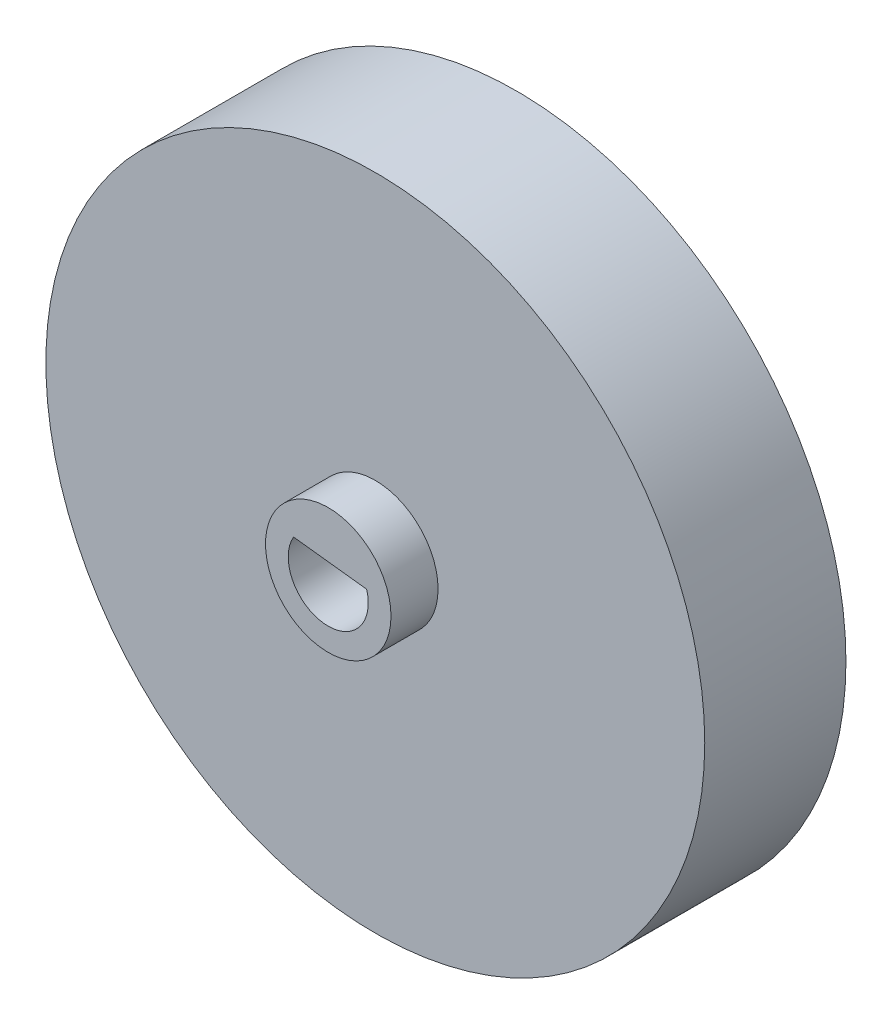
ISO-10303-21;
HEADER;
FILE_DESCRIPTION(('STEP AP214'),'2;1');
FILE_NAME('part.step','',(''),(''),'','','');
FILE_SCHEMA(('AUTOMOTIVE_DESIGN { 1 0 10303 214 1 1 1 1 }'));
ENDSEC;
DATA;
#1=APPLICATION_CONTEXT('core data for automotive mechanical design processes');
#2=APPLICATION_PROTOCOL_DEFINITION('international standard','automotive_design',2000,#1);
#3=PRODUCT_CONTEXT('',#1,'mechanical');
#4=PRODUCT('Part','Part','',(#3));
#5=PRODUCT_RELATED_PRODUCT_CATEGORY('part','',(#4));
#6=PRODUCT_DEFINITION_FORMATION('','',#4);
#7=PRODUCT_DEFINITION_CONTEXT('part definition',#1,'design');
#8=PRODUCT_DEFINITION('design','',#6,#7);
#9=PRODUCT_DEFINITION_SHAPE('','',#8);
#10=(LENGTH_UNIT() NAMED_UNIT(*) SI_UNIT(.MILLI.,.METRE.));
#11=(NAMED_UNIT(*) PLANE_ANGLE_UNIT() SI_UNIT($,.RADIAN.));
#12=(NAMED_UNIT(*) SI_UNIT($,.STERADIAN.) SOLID_ANGLE_UNIT());
#13=UNCERTAINTY_MEASURE_WITH_UNIT(LENGTH_MEASURE(1.E-05),#10,'distance_accuracy_value','');
#14=(GEOMETRIC_REPRESENTATION_CONTEXT(3) GLOBAL_UNCERTAINTY_ASSIGNED_CONTEXT((#13)) GLOBAL_UNIT_ASSIGNED_CONTEXT((#10,
#11,#12)) REPRESENTATION_CONTEXT('',''));
#15=CARTESIAN_POINT('',(0.,0.,0.));
#16=DIRECTION('',(0.,0.,1.));
#17=DIRECTION('',(1.,0.,0.));
#18=AXIS2_PLACEMENT_3D('',#15,#16,#17);
#19=CARTESIAN_POINT('',(0.,0.,24.));
#20=DIRECTION('',(0.,0.,1.));
#21=DIRECTION('',(1.,0.,0.));
#22=AXIS2_PLACEMENT_3D('',#19,#20,#21);
#23=PLANE('',#22);
#24=CARTESIAN_POINT('',(0.,0.,24.));
#25=DIRECTION('',(0.,0.,1.));
#26=DIRECTION('',(1.,0.,0.));
#27=AXIS2_PLACEMENT_3D('',#24,#25,#26);
#28=CIRCLE('',#27,8.);
#29=CARTESIAN_POINT('',(8.,0.,24.));
#30=VERTEX_POINT('',#29);
#31=EDGE_CURVE('E11',#30,#30,#28,.T.);
#32=ORIENTED_EDGE('',*,*,#31,.T.);
#33=EDGE_LOOP('',(#32));
#34=FACE_BOUND('',#33,.T.);
#35=DIRECTION('',(-0.993068456954926,0.117537397457838,0.));
#36=VECTOR('',#35,1.);
#37=CARTESIAN_POINT('',(4.89403723026289,1.43471237145316,24.));
#38=LINE('',#37,#36);
#39=CARTESIAN_POINT('',(4.89403723026289,1.43471237145316,24.));
#40=VERTEX_POINT('',#39);
#41=CARTESIAN_POINT('',(-4.42388764043154,2.53756145636654,24.));
#42=VERTEX_POINT('',#41);
#43=EDGE_CURVE('E84',#40,#42,#38,.T.);
#44=ORIENTED_EDGE('',*,*,#43,.F.);
#45=CARTESIAN_POINT('',(0.,0.,24.));
#46=DIRECTION('',(0.,0.,1.));
#47=DIRECTION('',(1.,0.,0.));
#48=AXIS2_PLACEMENT_3D('',#45,#46,#47);
#49=CIRCLE('',#48,5.1);
#50=EDGE_CURVE('E72',#42,#40,#49,.T.);
#51=ORIENTED_EDGE('',*,*,#50,.F.);
#52=EDGE_LOOP('',(#44,#51));
#53=FACE_BOUND('',#52,.T.);
#54=ADVANCED_FACE('F41',(#34,#53),#23,.T.);
#55=CARTESIAN_POINT('',(0.,0.,0.));
#56=DIRECTION('',(0.,0.,1.));
#57=DIRECTION('',(1.,0.,0.));
#58=AXIS2_PLACEMENT_3D('',#55,#56,#57);
#59=PLANE('',#58);
#60=CARTESIAN_POINT('',(0.,0.,0.));
#61=DIRECTION('',(0.,0.,1.));
#62=DIRECTION('',(1.,0.,0.));
#63=AXIS2_PLACEMENT_3D('',#60,#61,#62);
#64=CIRCLE('',#63,42.);
#65=CARTESIAN_POINT('',(42.,0.,0.));
#66=VERTEX_POINT('',#65);
#67=EDGE_CURVE('E81',#66,#66,#64,.T.);
#68=ORIENTED_EDGE('',*,*,#67,.F.);
#69=EDGE_LOOP('',(#68));
#70=FACE_BOUND('',#69,.T.);
#71=CARTESIAN_POINT('',(0.,0.,0.));
#72=DIRECTION('',(0.,0.,1.));
#73=DIRECTION('',(1.,0.,0.));
#74=AXIS2_PLACEMENT_3D('',#71,#72,#73);
#75=CIRCLE('',#74,5.1);
#76=CARTESIAN_POINT('',(-4.42388764043154,2.53756145636654,0.));
#77=VERTEX_POINT('',#76);
#78=CARTESIAN_POINT('',(4.89403723026289,1.43471237145316,0.));
#79=VERTEX_POINT('',#78);
#80=EDGE_CURVE('E62',#77,#79,#75,.T.);
#81=ORIENTED_EDGE('',*,*,#80,.T.);
#82=DIRECTION('',(-0.993068456954926,0.117537397457838,0.));
#83=VECTOR('',#82,1.);
#84=CARTESIAN_POINT('',(4.89403723026289,1.43471237145316,0.));
#85=LINE('',#84,#83);
#86=EDGE_CURVE('E68',#79,#77,#85,.T.);
#87=ORIENTED_EDGE('',*,*,#86,.T.);
#88=EDGE_LOOP('',(#81,#87));
#89=FACE_BOUND('',#88,.T.);
#90=ADVANCED_FACE('F77',(#70,#89),#59,.F.);
#91=CARTESIAN_POINT('',(0.,0.,24.));
#92=DIRECTION('',(0.,0.,-1.));
#93=DIRECTION('',(-1.,0.,0.));
#94=AXIS2_PLACEMENT_3D('',#91,#92,#93);
#95=CYLINDRICAL_SURFACE('',#94,8.);
#96=CARTESIAN_POINT('',(0.,0.,18.));
#97=DIRECTION('',(0.,0.,1.));
#98=DIRECTION('',(1.,0.,0.));
#99=AXIS2_PLACEMENT_3D('',#96,#97,#98);
#100=CIRCLE('',#99,8.);
#101=CARTESIAN_POINT('',(8.,0.,18.));
#102=VERTEX_POINT('',#101);
#103=EDGE_CURVE('E89',#102,#102,#100,.T.);
#104=ORIENTED_EDGE('',*,*,#103,.T.);
#105=EDGE_LOOP('',(#104));
#106=FACE_BOUND('',#105,.T.);
#107=ORIENTED_EDGE('',*,*,#31,.F.);
#108=EDGE_LOOP('',(#107));
#109=FACE_BOUND('',#108,.T.);
#110=ADVANCED_FACE('F43',(#106,#109),#95,.T.);
#111=CARTESIAN_POINT('',(0.,0.,24.));
#112=DIRECTION('',(0.,0.,-1.));
#113=DIRECTION('',(-1.,0.,0.));
#114=AXIS2_PLACEMENT_3D('',#111,#112,#113);
#115=CYLINDRICAL_SURFACE('',#114,5.1);
#116=ORIENTED_EDGE('',*,*,#80,.F.);
#117=DIRECTION('',(0.,0.,-1.));
#118=VECTOR('',#117,1.);
#119=CARTESIAN_POINT('',(-4.42388764043154,2.53756145636654,24.));
#120=LINE('',#119,#118);
#121=EDGE_CURVE('E70',#42,#77,#120,.T.);
#122=ORIENTED_EDGE('',*,*,#121,.F.);
#123=ORIENTED_EDGE('',*,*,#50,.T.);
#124=DIRECTION('',(0.,0.,-1.));
#125=VECTOR('',#124,1.);
#126=CARTESIAN_POINT('',(4.89403723026289,1.43471237145316,24.));
#127=LINE('',#126,#125);
#128=EDGE_CURVE('E49',#40,#79,#127,.T.);
#129=ORIENTED_EDGE('',*,*,#128,.T.);
#130=EDGE_LOOP('',(#116,#122,#123,#129));
#131=FACE_BOUND('',#130,.T.);
#132=ADVANCED_FACE('F74',(#131),#115,.F.);
#133=CARTESIAN_POINT('',(4.89403723026289,1.43471237145316,24.));
#134=DIRECTION('',(-0.117537397457838,-0.993068456954926,0.));
#135=DIRECTION('',(0.993068456954926,-0.117537397457838,0.));
#136=AXIS2_PLACEMENT_3D('',#133,#134,#135);
#137=PLANE('',#136);
#138=ORIENTED_EDGE('',*,*,#86,.F.);
#139=ORIENTED_EDGE('',*,*,#128,.F.);
#140=ORIENTED_EDGE('',*,*,#43,.T.);
#141=ORIENTED_EDGE('',*,*,#121,.T.);
#142=EDGE_LOOP('',(#138,#139,#140,#141));
#143=FACE_BOUND('',#142,.T.);
#144=ADVANCED_FACE('F69',(#143),#137,.T.);
#145=CARTESIAN_POINT('',(0.,0.,18.));
#146=DIRECTION('',(0.,0.,1.));
#147=DIRECTION('',(1.,0.,0.));
#148=AXIS2_PLACEMENT_3D('',#145,#146,#147);
#149=PLANE('',#148);
#150=CARTESIAN_POINT('',(0.,0.,18.));
#151=DIRECTION('',(0.,0.,1.));
#152=DIRECTION('',(1.,0.,0.));
#153=AXIS2_PLACEMENT_3D('',#150,#151,#152);
#154=CIRCLE('',#153,42.);
#155=CARTESIAN_POINT('',(42.,0.,18.));
#156=VERTEX_POINT('',#155);
#157=EDGE_CURVE('E78',#156,#156,#154,.T.);
#158=ORIENTED_EDGE('',*,*,#157,.T.);
#159=EDGE_LOOP('',(#158));
#160=FACE_BOUND('',#159,.T.);
#161=ORIENTED_EDGE('',*,*,#103,.F.);
#162=EDGE_LOOP('',(#161));
#163=FACE_BOUND('',#162,.T.);
#164=ADVANCED_FACE('F96',(#160,#163),#149,.T.);
#165=CARTESIAN_POINT('',(0.,0.,18.));
#166=DIRECTION('',(0.,0.,-1.));
#167=DIRECTION('',(-1.,0.,0.));
#168=AXIS2_PLACEMENT_3D('',#165,#166,#167);
#169=CYLINDRICAL_SURFACE('',#168,42.);
#170=ORIENTED_EDGE('',*,*,#67,.T.);
#171=EDGE_LOOP('',(#170));
#172=FACE_BOUND('',#171,.T.);
#173=ORIENTED_EDGE('',*,*,#157,.F.);
#174=EDGE_LOOP('',(#173));
#175=FACE_BOUND('',#174,.T.);
#176=ADVANCED_FACE('F98',(#172,#175),#169,.T.);
#177=CLOSED_SHELL('',(#54,#90,#110,#132,#144,#164,#176));
#178=MANIFOLD_SOLID_BREP('B2',#177);
#179=ADVANCED_BREP_SHAPE_REPRESENTATION('',(#18,#178),#14);
#180=SHAPE_DEFINITION_REPRESENTATION(#9,#179);
ENDSEC;
END-ISO-10303-21;
